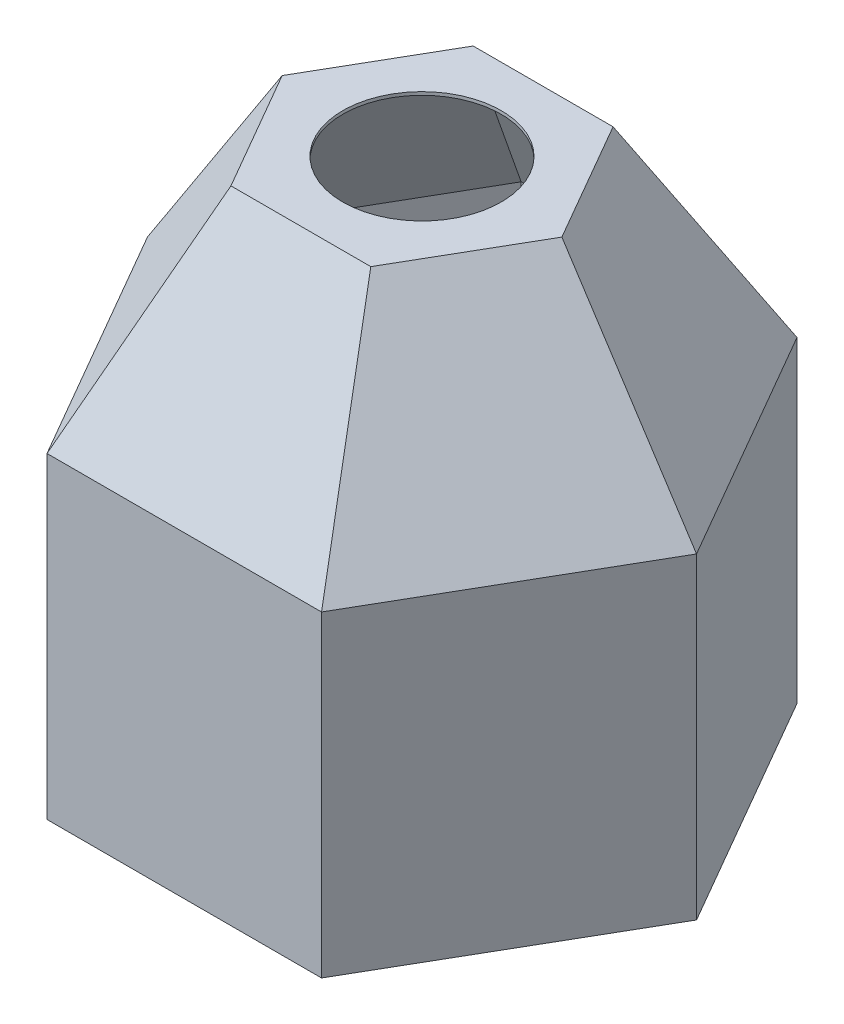
ISO-10303-21;
HEADER;
FILE_DESCRIPTION(('STEP AP214'),'2;1');
FILE_NAME('part.step','',(''),(''),'','','');
FILE_SCHEMA(('AUTOMOTIVE_DESIGN { 1 0 10303 214 1 1 1 1 }'));
ENDSEC;
DATA;
#1=APPLICATION_CONTEXT('core data for automotive mechanical design processes');
#2=APPLICATION_PROTOCOL_DEFINITION('international standard','automotive_design',2000,#1);
#3=PRODUCT_CONTEXT('',#1,'mechanical');
#4=PRODUCT('Part','Part','',(#3));
#5=PRODUCT_RELATED_PRODUCT_CATEGORY('part','',(#4));
#6=PRODUCT_DEFINITION_FORMATION('','',#4);
#7=PRODUCT_DEFINITION_CONTEXT('part definition',#1,'design');
#8=PRODUCT_DEFINITION('design','',#6,#7);
#9=PRODUCT_DEFINITION_SHAPE('','',#8);
#10=(LENGTH_UNIT() NAMED_UNIT(*) SI_UNIT(.MILLI.,.METRE.));
#11=(NAMED_UNIT(*) PLANE_ANGLE_UNIT() SI_UNIT($,.RADIAN.));
#12=(NAMED_UNIT(*) SI_UNIT($,.STERADIAN.) SOLID_ANGLE_UNIT());
#13=UNCERTAINTY_MEASURE_WITH_UNIT(LENGTH_MEASURE(1.E-05),#10,'distance_accuracy_value','');
#14=(GEOMETRIC_REPRESENTATION_CONTEXT(3) GLOBAL_UNCERTAINTY_ASSIGNED_CONTEXT((#13)) GLOBAL_UNIT_ASSIGNED_CONTEXT((#10,
#11,#12)) REPRESENTATION_CONTEXT('',''));
#15=CARTESIAN_POINT('',(0.,0.,0.));
#16=DIRECTION('',(0.,0.,1.));
#17=DIRECTION('',(1.,0.,0.));
#18=AXIS2_PLACEMENT_3D('',#15,#16,#17);
#19=CARTESIAN_POINT('',(130.222507916258,304.8,-225.552));
#20=DIRECTION('',(0.866025403784439,0.,-0.5));
#21=DIRECTION('',(-0.5,0.,-0.866025403784439));
#22=AXIS2_PLACEMENT_3D('',#19,#20,#21);
#23=PLANE('',#22);
#24=DIRECTION('',(0.499999999999995,0.,0.866025403784442));
#25=VECTOR('',#24,1.);
#26=CARTESIAN_POINT('',(130.222507916261,3.048,-225.551999999998));
#27=LINE('',#26,#25);
#28=CARTESIAN_POINT('',(130.222507916258,3.04800000000002,-225.552));
#29=VERTEX_POINT('',#28);
#30=CARTESIAN_POINT('',(260.445015832517,3.048,0.));
#31=VERTEX_POINT('',#30);
#32=EDGE_CURVE('E213',#29,#31,#27,.T.);
#33=ORIENTED_EDGE('',*,*,#32,.T.);
#34=DIRECTION('',(0.,-1.,0.));
#35=VECTOR('',#34,1.);
#36=CARTESIAN_POINT('',(260.445015832517,304.8,0.));
#37=LINE('',#36,#35);
#38=CARTESIAN_POINT('',(260.445015832517,304.8,0.));
#39=VERTEX_POINT('',#38);
#40=EDGE_CURVE('E197',#39,#31,#37,.T.);
#41=ORIENTED_EDGE('',*,*,#40,.F.);
#42=CARTESIAN_POINT('',(130.222507916258,304.8,-225.552));
#43=DIRECTION('',(0.5,0.,0.866025403784439));
#44=VECTOR('',#43,1.);
#45=LINE('',#42,#44);
#46=CARTESIAN_POINT('',(130.222507916258,304.8,-225.552));
#47=VERTEX_POINT('',#46);
#48=EDGE_CURVE('E270',#47,#39,#45,.T.);
#49=ORIENTED_EDGE('',*,*,#48,.F.);
#50=DIRECTION('',(0.,-1.,0.));
#51=VECTOR('',#50,1.);
#52=CARTESIAN_POINT('',(130.222507916258,304.8,-225.552));
#53=LINE('',#52,#51);
#54=EDGE_CURVE('E214',#47,#29,#53,.T.);
#55=ORIENTED_EDGE('',*,*,#54,.T.);
#56=EDGE_LOOP('',(#33,#41,#49,#55));
#57=FACE_BOUND('',#56,.T.);
#58=ADVANCED_FACE('F66',(#57),#23,.F.);
#59=CARTESIAN_POINT('',(-130.222507916258,304.8,-225.552));
#60=DIRECTION('',(0.,0.,-1.));
#61=DIRECTION('',(-1.,0.,0.));
#62=AXIS2_PLACEMENT_3D('',#59,#60,#61);
#63=PLANE('',#62);
#64=DIRECTION('',(1.,0.,0.));
#65=VECTOR('',#64,1.);
#66=CARTESIAN_POINT('',(-130.222507916256,3.048,-225.552000000001));
#67=LINE('',#66,#65);
#68=CARTESIAN_POINT('',(-130.222507916258,3.04800000000005,-225.552));
#69=VERTEX_POINT('',#68);
#70=EDGE_CURVE('E84',#69,#29,#67,.T.);
#71=ORIENTED_EDGE('',*,*,#70,.T.);
#72=ORIENTED_EDGE('',*,*,#54,.F.);
#73=CARTESIAN_POINT('',(-130.222507916258,304.8,-225.552));
#74=DIRECTION('',(1.,0.,0.));
#75=VECTOR('',#74,1.);
#76=LINE('',#73,#75);
#77=CARTESIAN_POINT('',(-130.222507916258,304.8,-225.552));
#78=VERTEX_POINT('',#77);
#79=EDGE_CURVE('E210',#78,#47,#76,.T.);
#80=ORIENTED_EDGE('',*,*,#79,.F.);
#81=DIRECTION('',(0.,-1.,0.));
#82=VECTOR('',#81,1.);
#83=CARTESIAN_POINT('',(-130.222507916258,304.8,-225.552));
#84=LINE('',#83,#82);
#85=EDGE_CURVE('E311',#78,#69,#84,.T.);
#86=ORIENTED_EDGE('',*,*,#85,.T.);
#87=EDGE_LOOP('',(#71,#72,#80,#86));
#88=FACE_BOUND('',#87,.T.);
#89=ADVANCED_FACE('F288',(#88),#63,.F.);
#90=CARTESIAN_POINT('',(-260.445015832517,304.8,0.));
#91=DIRECTION('',(-0.866025403784439,0.,-0.5));
#92=DIRECTION('',(-0.5,0.,0.866025403784439));
#93=AXIS2_PLACEMENT_3D('',#90,#91,#92);
#94=PLANE('',#93);
#95=DIRECTION('',(0.500000000000007,0.,-0.866025403784434));
#96=VECTOR('',#95,1.);
#97=CARTESIAN_POINT('',(-260.445015832517,3.048,-1.8464334007635E-12));
#98=LINE('',#97,#96);
#99=CARTESIAN_POINT('',(-260.445015832517,3.04800000000002,0.));
#100=VERTEX_POINT('',#99);
#101=EDGE_CURVE('E92',#100,#69,#98,.T.);
#102=ORIENTED_EDGE('',*,*,#101,.T.);
#103=ORIENTED_EDGE('',*,*,#85,.F.);
#104=CARTESIAN_POINT('',(-260.445015832517,304.8,-1.11022302462516E-13));
#105=DIRECTION('',(0.5,0.,-0.866025403784439));
#106=VECTOR('',#105,1.);
#107=LINE('',#104,#106);
#108=CARTESIAN_POINT('',(-260.445015832517,304.8,0.));
#109=VERTEX_POINT('',#108);
#110=EDGE_CURVE('E727',#109,#78,#107,.T.);
#111=ORIENTED_EDGE('',*,*,#110,.F.);
#112=DIRECTION('',(0.,-1.,0.));
#113=VECTOR('',#112,1.);
#114=CARTESIAN_POINT('',(-260.445015832517,304.8,0.));
#115=LINE('',#114,#113);
#116=EDGE_CURVE('E305',#109,#100,#115,.T.);
#117=ORIENTED_EDGE('',*,*,#116,.T.);
#118=EDGE_LOOP('',(#102,#103,#111,#117));
#119=FACE_BOUND('',#118,.T.);
#120=ADVANCED_FACE('F277',(#119),#94,.F.);
#121=CARTESIAN_POINT('',(-130.222507916258,304.8,225.552));
#122=DIRECTION('',(-0.866025403784439,0.,0.5));
#123=DIRECTION('',(0.5,0.,0.866025403784439));
#124=AXIS2_PLACEMENT_3D('',#121,#122,#123);
#125=PLANE('',#124);
#126=DIRECTION('',(-0.499999999999995,0.,-0.866025403784442));
#127=VECTOR('',#126,1.);
#128=CARTESIAN_POINT('',(-130.22250791626,3.048,225.551999999999));
#129=LINE('',#128,#127);
#130=CARTESIAN_POINT('',(-130.222507916258,3.04800000000002,225.552));
#131=VERTEX_POINT('',#130);
#132=EDGE_CURVE('E222',#131,#100,#129,.T.);
#133=ORIENTED_EDGE('',*,*,#132,.T.);
#134=ORIENTED_EDGE('',*,*,#116,.F.);
#135=CARTESIAN_POINT('',(-130.222507916258,304.8,225.552));
#136=DIRECTION('',(-0.5,0.,-0.866025403784439));
#137=VECTOR('',#136,1.);
#138=LINE('',#135,#137);
#139=CARTESIAN_POINT('',(-130.222507916258,304.8,225.552));
#140=VERTEX_POINT('',#139);
#141=EDGE_CURVE('E718',#140,#109,#138,.T.);
#142=ORIENTED_EDGE('',*,*,#141,.F.);
#143=DIRECTION('',(0.,-1.,0.));
#144=VECTOR('',#143,1.);
#145=CARTESIAN_POINT('',(-130.222507916258,304.8,225.552));
#146=LINE('',#145,#144);
#147=EDGE_CURVE('E312',#140,#131,#146,.T.);
#148=ORIENTED_EDGE('',*,*,#147,.T.);
#149=EDGE_LOOP('',(#133,#134,#142,#148));
#150=FACE_BOUND('',#149,.T.);
#151=ADVANCED_FACE('F287',(#150),#125,.F.);
#152=CARTESIAN_POINT('',(130.222507916259,304.8,225.552));
#153=DIRECTION('',(0.,0.,1.));
#154=DIRECTION('',(1.,0.,0.));
#155=AXIS2_PLACEMENT_3D('',#152,#153,#154);
#156=PLANE('',#155);
#157=DIRECTION('',(-1.,0.,0.));
#158=VECTOR('',#157,1.);
#159=CARTESIAN_POINT('',(130.222507916258,3.048,225.552));
#160=LINE('',#159,#158);
#161=CARTESIAN_POINT('',(130.222507916259,3.04800000000005,225.552));
#162=VERTEX_POINT('',#161);
#163=EDGE_CURVE('E220',#162,#131,#160,.T.);
#164=ORIENTED_EDGE('',*,*,#163,.T.);
#165=ORIENTED_EDGE('',*,*,#147,.F.);
#166=CARTESIAN_POINT('',(130.222507916259,304.8,225.552));
#167=DIRECTION('',(-1.,0.,0.));
#168=VECTOR('',#167,1.);
#169=LINE('',#166,#168);
#170=CARTESIAN_POINT('',(130.222507916259,304.8,225.552));
#171=VERTEX_POINT('',#170);
#172=EDGE_CURVE('E334',#171,#140,#169,.T.);
#173=ORIENTED_EDGE('',*,*,#172,.F.);
#174=DIRECTION('',(0.,-1.,0.));
#175=VECTOR('',#174,1.);
#176=CARTESIAN_POINT('',(130.222507916259,304.8,225.552));
#177=LINE('',#176,#175);
#178=EDGE_CURVE('E209',#171,#162,#177,.T.);
#179=ORIENTED_EDGE('',*,*,#178,.T.);
#180=EDGE_LOOP('',(#164,#165,#173,#179));
#181=FACE_BOUND('',#180,.T.);
#182=ADVANCED_FACE('F294',(#181),#156,.F.);
#183=CARTESIAN_POINT('',(260.445015832517,304.8,0.));
#184=DIRECTION('',(0.866025403784439,0.,0.5));
#185=DIRECTION('',(0.5,0.,-0.866025403784439));
#186=AXIS2_PLACEMENT_3D('',#183,#184,#185);
#187=PLANE('',#186);
#188=DIRECTION('',(-0.500000000000001,0.,0.866025403784438));
#189=VECTOR('',#188,1.);
#190=CARTESIAN_POINT('',(260.445015832517,3.048,0.));
#191=LINE('',#190,#189);
#192=EDGE_CURVE('E202',#31,#162,#191,.T.);
#193=ORIENTED_EDGE('',*,*,#192,.T.);
#194=ORIENTED_EDGE('',*,*,#178,.F.);
#195=CARTESIAN_POINT('',(260.445015832517,304.8,0.));
#196=DIRECTION('',(-0.5,0.,0.866025403784439));
#197=VECTOR('',#196,1.);
#198=LINE('',#195,#197);
#199=EDGE_CURVE('E205',#39,#171,#198,.T.);
#200=ORIENTED_EDGE('',*,*,#199,.F.);
#201=ORIENTED_EDGE('',*,*,#40,.T.);
#202=EDGE_LOOP('',(#193,#194,#200,#201));
#203=FACE_BOUND('',#202,.T.);
#204=ADVANCED_FACE('F199',(#203),#187,.F.);
#205=CARTESIAN_POINT('',(0.,169.799612844769,301.565405552463));
#206=DIRECTION('',(0.,-0.490632304430779,-0.871366709169534));
#207=DIRECTION('',(0.,0.871366709169534,-0.490632304430779));
#208=AXIS2_PLACEMENT_3D('',#205,#206,#207);
#209=PLANE('',#208);
#210=DIRECTION('',(-0.272543219118308,-0.838379851171602,0.472058702771288));
#211=VECTOR('',#210,1.);
#212=CARTESIAN_POINT('',(-65.4867364082733,503.936,113.426354681));
#213=LINE('',#212,#211);
#214=CARTESIAN_POINT('',(-66.4775900538037,500.888,115.142563537923));
#215=VERTEX_POINT('',#214);
#216=EDGE_CURVE('E249',#215,#140,#213,.T.);
#217=ORIENTED_EDGE('',*,*,#216,.F.);
#218=DIRECTION('',(1.,0.,0.));
#219=VECTOR('',#218,1.);
#220=CARTESIAN_POINT('',(0.,500.888,115.142563537924));
#221=LINE('',#220,#219);
#222=CARTESIAN_POINT('',(66.4775900538037,500.888,115.142563537924));
#223=VERTEX_POINT('',#222);
#224=EDGE_CURVE('E246',#215,#223,#221,.T.);
#225=ORIENTED_EDGE('',*,*,#224,.T.);
#226=DIRECTION('',(0.272543219118309,-0.838379851171602,0.472058702771287));
#227=VECTOR('',#226,1.);
#228=CARTESIAN_POINT('',(65.4867364082733,503.936,113.426354681));
#229=LINE('',#228,#227);
#230=EDGE_CURVE('E70',#223,#171,#229,.T.);
#231=ORIENTED_EDGE('',*,*,#230,.T.);
#232=ORIENTED_EDGE('',*,*,#172,.T.);
#233=EDGE_LOOP('',(#217,#225,#231,#232));
#234=FACE_BOUND('',#233,.T.);
#235=ADVANCED_FACE('F348',(#234),#209,.T.);
#236=CARTESIAN_POINT('',(261.16330211099,169.799612844769,150.782702776231));
#237=DIRECTION('',(-0.754625706152864,-0.490632304430779,-0.435683354584767));
#238=DIRECTION('',(0.545086438236617,-0.838379851171603,0.));
#239=AXIS2_PLACEMENT_3D('',#236,#237,#238);
#240=PLANE('',#239);
#241=ORIENTED_EDGE('',*,*,#230,.F.);
#242=DIRECTION('',(0.5,0.,-0.866025403784439));
#243=VECTOR('',#242,1.);
#244=CARTESIAN_POINT('',(99.7163850807056,500.888,57.5712817689618));
#245=LINE('',#244,#243);
#246=CARTESIAN_POINT('',(132.955180107607,500.888,0.));
#247=VERTEX_POINT('',#246);
#248=EDGE_CURVE('E243',#223,#247,#245,.T.);
#249=ORIENTED_EDGE('',*,*,#248,.T.);
#250=DIRECTION('',(0.545086438236617,-0.838379851171602,0.));
#251=VECTOR('',#250,1.);
#252=CARTESIAN_POINT('',(130.973472816547,503.936,0.));
#253=LINE('',#252,#251);
#254=EDGE_CURVE('E268',#247,#39,#253,.T.);
#255=ORIENTED_EDGE('',*,*,#254,.T.);
#256=ORIENTED_EDGE('',*,*,#199,.T.);
#257=EDGE_LOOP('',(#241,#249,#255,#256));
#258=FACE_BOUND('',#257,.T.);
#259=ADVANCED_FACE('F693',(#258),#240,.T.);
#260=CARTESIAN_POINT('',(-261.163302110989,169.799612844768,150.782702776231));
#261=DIRECTION('',(0.754625706152864,-0.490632304430778,-0.435683354584767));
#262=DIRECTION('',(0.545086438236617,0.838379851171603,0.));
#263=AXIS2_PLACEMENT_3D('',#260,#261,#262);
#264=PLANE('',#263);
#265=DIRECTION('',(-0.545086438236617,-0.838379851171603,0.));
#266=VECTOR('',#265,1.);
#267=CARTESIAN_POINT('',(-130.973472816547,503.936,0.));
#268=LINE('',#267,#266);
#269=CARTESIAN_POINT('',(-132.955180107607,500.888,0.));
#270=VERTEX_POINT('',#269);
#271=EDGE_CURVE('E254',#270,#109,#268,.T.);
#272=ORIENTED_EDGE('',*,*,#271,.F.);
#273=DIRECTION('',(0.5,0.,0.866025403784439));
#274=VECTOR('',#273,1.);
#275=CARTESIAN_POINT('',(-99.7163850807055,500.888,57.5712817689617));
#276=LINE('',#275,#274);
#277=EDGE_CURVE('E240',#270,#215,#276,.T.);
#278=ORIENTED_EDGE('',*,*,#277,.T.);
#279=ORIENTED_EDGE('',*,*,#216,.T.);
#280=ORIENTED_EDGE('',*,*,#141,.T.);
#281=EDGE_LOOP('',(#272,#278,#279,#280));
#282=FACE_BOUND('',#281,.T.);
#283=ADVANCED_FACE('F657',(#282),#264,.T.);
#284=CARTESIAN_POINT('',(-261.163302110989,169.799612844769,-150.782702776231));
#285=DIRECTION('',(0.754625706152864,-0.490632304430778,0.435683354584767));
#286=DIRECTION('',(0.545086438236617,0.838379851171603,0.));
#287=AXIS2_PLACEMENT_3D('',#284,#285,#286);
#288=PLANE('',#287);
#289=DIRECTION('',(-0.272543219118308,-0.838379851171603,-0.472058702771288));
#290=VECTOR('',#289,1.);
#291=CARTESIAN_POINT('',(-65.4867364082733,503.936,-113.426354681));
#292=LINE('',#291,#290);
#293=CARTESIAN_POINT('',(-66.4775900538037,500.888,-115.142563537924));
#294=VERTEX_POINT('',#293);
#295=EDGE_CURVE('E256',#294,#78,#292,.T.);
#296=ORIENTED_EDGE('',*,*,#295,.F.);
#297=DIRECTION('',(-0.5,0.,0.866025403784439));
#298=VECTOR('',#297,1.);
#299=CARTESIAN_POINT('',(-99.7163850807056,500.888,-57.5712817689618));
#300=LINE('',#299,#298);
#301=EDGE_CURVE('E237',#294,#270,#300,.T.);
#302=ORIENTED_EDGE('',*,*,#301,.T.);
#303=ORIENTED_EDGE('',*,*,#271,.T.);
#304=ORIENTED_EDGE('',*,*,#110,.T.);
#305=EDGE_LOOP('',(#296,#302,#303,#304));
#306=FACE_BOUND('',#305,.T.);
#307=ADVANCED_FACE('F646',(#306),#288,.T.);
#308=CARTESIAN_POINT('',(0.,169.799612844769,-301.565405552463));
#309=DIRECTION('',(0.,-0.490632304430779,0.871366709169534));
#310=DIRECTION('',(0.,-0.871366709169534,-0.490632304430779));
#311=AXIS2_PLACEMENT_3D('',#308,#309,#310);
#312=PLANE('',#311);
#313=DIRECTION('',(0.272543219118308,-0.838379851171602,-0.472058702771288));
#314=VECTOR('',#313,1.);
#315=CARTESIAN_POINT('',(65.4867364082733,503.936,-113.426354681));
#316=LINE('',#315,#314);
#317=CARTESIAN_POINT('',(66.4775900538037,500.888,-115.142563537924));
#318=VERTEX_POINT('',#317);
#319=EDGE_CURVE('E266',#318,#47,#316,.T.);
#320=ORIENTED_EDGE('',*,*,#319,.F.);
#321=DIRECTION('',(-1.,0.,0.));
#322=VECTOR('',#321,1.);
#323=CARTESIAN_POINT('',(0.,500.888,-115.142563537924));
#324=LINE('',#323,#322);
#325=EDGE_CURVE('E232',#318,#294,#324,.T.);
#326=ORIENTED_EDGE('',*,*,#325,.T.);
#327=ORIENTED_EDGE('',*,*,#295,.T.);
#328=ORIENTED_EDGE('',*,*,#79,.T.);
#329=EDGE_LOOP('',(#320,#326,#327,#328));
#330=FACE_BOUND('',#329,.T.);
#331=ADVANCED_FACE('F656',(#330),#312,.T.);
#332=CARTESIAN_POINT('',(261.163302110989,169.799612844769,-150.782702776231));
#333=DIRECTION('',(-0.754625706152864,-0.490632304430779,0.435683354584767));
#334=DIRECTION('',(0.545086438236617,-0.838379851171603,0.));
#335=AXIS2_PLACEMENT_3D('',#332,#333,#334);
#336=PLANE('',#335);
#337=ORIENTED_EDGE('',*,*,#254,.F.);
#338=DIRECTION('',(-0.5,0.,-0.866025403784439));
#339=VECTOR('',#338,1.);
#340=CARTESIAN_POINT('',(99.7163850807056,500.888,-57.5712817689617));
#341=LINE('',#340,#339);
#342=EDGE_CURVE('E12',#247,#318,#341,.T.);
#343=ORIENTED_EDGE('',*,*,#342,.T.);
#344=ORIENTED_EDGE('',*,*,#319,.T.);
#345=ORIENTED_EDGE('',*,*,#48,.T.);
#346=EDGE_LOOP('',(#337,#343,#344,#345));
#347=FACE_BOUND('',#346,.T.);
#348=ADVANCED_FACE('F663',(#347),#336,.T.);
#349=CARTESIAN_POINT('',(0.,503.936,0.));
#350=DIRECTION('',(0.,1.,0.));
#351=DIRECTION('',(0.,0.,1.));
#352=AXIS2_PLACEMENT_3D('',#349,#350,#351);
#353=PLANE('',#352);
#354=CARTESIAN_POINT('',(0.,503.936,0.));
#355=DIRECTION('',(0.,1.,0.));
#356=DIRECTION('',(0.,0.,1.));
#357=AXIS2_PLACEMENT_3D('',#354,#355,#356);
#358=CIRCLE('',#357,76.2);
#359=CARTESIAN_POINT('',(0.,503.936,76.2));
#360=VERTEX_POINT('',#359);
#361=EDGE_CURVE('E228',#360,#360,#358,.T.);
#362=ORIENTED_EDGE('',*,*,#361,.F.);
#363=EDGE_LOOP('',(#362));
#364=FACE_BOUND('',#363,.T.);
#365=DIRECTION('',(0.5,0.,-0.866025403784439));
#366=VECTOR('',#365,1.);
#367=CARTESIAN_POINT('',(67.2465,503.936,116.474354631181));
#368=LINE('',#367,#366);
#369=CARTESIAN_POINT('',(67.2465,503.936,116.474354631181));
#370=VERTEX_POINT('',#369);
#371=CARTESIAN_POINT('',(134.493,503.936,0.));
#372=VERTEX_POINT('',#371);
#373=EDGE_CURVE('E370',#370,#372,#368,.T.);
#374=ORIENTED_EDGE('',*,*,#373,.T.);
#375=DIRECTION('',(-0.5,0.,-0.866025403784439));
#376=VECTOR('',#375,1.);
#377=CARTESIAN_POINT('',(134.493,503.936,0.));
#378=LINE('',#377,#376);
#379=CARTESIAN_POINT('',(67.2464999999999,503.936,-116.474354631181));
#380=VERTEX_POINT('',#379);
#381=EDGE_CURVE('E446',#372,#380,#378,.T.);
#382=ORIENTED_EDGE('',*,*,#381,.T.);
#383=DIRECTION('',(-1.,0.,0.));
#384=VECTOR('',#383,1.);
#385=CARTESIAN_POINT('',(67.2464999999999,503.936,-116.474354631181));
#386=LINE('',#385,#384);
#387=CARTESIAN_POINT('',(-67.2465,503.936,-116.474354631181));
#388=VERTEX_POINT('',#387);
#389=EDGE_CURVE('E449',#380,#388,#386,.T.);
#390=ORIENTED_EDGE('',*,*,#389,.T.);
#391=DIRECTION('',(-0.5,0.,0.866025403784439));
#392=VECTOR('',#391,1.);
#393=CARTESIAN_POINT('',(-67.2465,503.936,-116.474354631181));
#394=LINE('',#393,#392);
#395=CARTESIAN_POINT('',(-134.493,503.936,0.));
#396=VERTEX_POINT('',#395);
#397=EDGE_CURVE('E530',#388,#396,#394,.T.);
#398=ORIENTED_EDGE('',*,*,#397,.T.);
#399=DIRECTION('',(0.5,0.,0.866025403784439));
#400=VECTOR('',#399,1.);
#401=CARTESIAN_POINT('',(-134.493,503.936,0.));
#402=LINE('',#401,#400);
#403=CARTESIAN_POINT('',(-67.2465,503.936,116.474354631181));
#404=VERTEX_POINT('',#403);
#405=EDGE_CURVE('E597',#396,#404,#402,.T.);
#406=ORIENTED_EDGE('',*,*,#405,.T.);
#407=DIRECTION('',(1.,0.,0.));
#408=VECTOR('',#407,1.);
#409=CARTESIAN_POINT('',(-67.2465,503.936,116.474354631181));
#410=LINE('',#409,#408);
#411=EDGE_CURVE('E601',#404,#370,#410,.T.);
#412=ORIENTED_EDGE('',*,*,#411,.T.);
#413=EDGE_LOOP('',(#374,#382,#390,#398,#406,#412));
#414=FACE_BOUND('',#413,.T.);
#415=ADVANCED_FACE('F352',(#364,#414),#353,.T.);
#416=CARTESIAN_POINT('',(131.982271536751,304.8,228.599999999999));
#417=DIRECTION('',(-0.866025403784442,0.,-0.499999999999995));
#418=DIRECTION('',(-0.499999999999995,0.,0.866025403784442));
#419=AXIS2_PLACEMENT_3D('',#416,#417,#418);
#420=PLANE('',#419);
#421=DIRECTION('',(0.499999999999995,0.,-0.866025403784441));
#422=VECTOR('',#421,1.);
#423=CARTESIAN_POINT('',(131.982271536751,0.,228.599999999999));
#424=LINE('',#423,#422);
#425=CARTESIAN_POINT('',(131.982271536751,0.,228.599999999999));
#426=VERTEX_POINT('',#425);
#427=CARTESIAN_POINT('',(263.964543073497,0.,0.));
#428=VERTEX_POINT('',#427);
#429=EDGE_CURVE('E429',#426,#428,#424,.T.);
#430=ORIENTED_EDGE('',*,*,#429,.T.);
#431=DIRECTION('',(0.,-1.,0.));
#432=VECTOR('',#431,1.);
#433=CARTESIAN_POINT('',(263.964543073497,304.8,0.));
#434=LINE('',#433,#432);
#435=CARTESIAN_POINT('',(263.964543073497,304.8,0.));
#436=VERTEX_POINT('',#435);
#437=EDGE_CURVE('E76',#436,#428,#434,.T.);
#438=ORIENTED_EDGE('',*,*,#437,.F.);
#439=DIRECTION('',(0.499999999999995,0.,-0.866025403784442));
#440=VECTOR('',#439,1.);
#441=CARTESIAN_POINT('',(131.982271536751,304.8,228.599999999999));
#442=LINE('',#441,#440);
#443=CARTESIAN_POINT('',(131.982271536751,304.799999999999,228.599999999999));
#444=VERTEX_POINT('',#443);
#445=EDGE_CURVE('E384',#444,#436,#442,.T.);
#446=ORIENTED_EDGE('',*,*,#445,.F.);
#447=DIRECTION('',(0.,-1.,0.));
#448=VECTOR('',#447,1.);
#449=CARTESIAN_POINT('',(131.982271536751,304.8,228.599999999999));
#450=LINE('',#449,#448);
#451=EDGE_CURVE('E392',#444,#426,#450,.T.);
#452=ORIENTED_EDGE('',*,*,#451,.T.);
#453=EDGE_LOOP('',(#430,#438,#446,#452));
#454=FACE_BOUND('',#453,.T.);
#455=ADVANCED_FACE('F68',(#454),#420,.F.);
#456=CARTESIAN_POINT('',(263.964543073497,304.8,0.));
#457=DIRECTION('',(-0.866025403784438,0.,0.500000000000001));
#458=DIRECTION('',(0.500000000000001,0.,0.866025403784438));
#459=AXIS2_PLACEMENT_3D('',#456,#457,#458);
#460=PLANE('',#459);
#461=DIRECTION('',(-0.500000000000001,0.,-0.866025403784438));
#462=VECTOR('',#461,1.);
#463=CARTESIAN_POINT('',(263.964543073497,0.,0.));
#464=LINE('',#463,#462);
#465=CARTESIAN_POINT('',(131.982271536748,0.,-228.6));
#466=VERTEX_POINT('',#465);
#467=EDGE_CURVE('E427',#428,#466,#464,.T.);
#468=ORIENTED_EDGE('',*,*,#467,.T.);
#469=DIRECTION('',(0.,-1.,0.));
#470=VECTOR('',#469,1.);
#471=CARTESIAN_POINT('',(131.982271536748,304.8,-228.6));
#472=LINE('',#471,#470);
#473=CARTESIAN_POINT('',(131.982271536748,304.8,-228.6));
#474=VERTEX_POINT('',#473);
#475=EDGE_CURVE('E404',#474,#466,#472,.T.);
#476=ORIENTED_EDGE('',*,*,#475,.F.);
#477=DIRECTION('',(-0.500000000000001,0.,-0.866025403784438));
#478=VECTOR('',#477,1.);
#479=CARTESIAN_POINT('',(263.964543073497,304.8,0.));
#480=LINE('',#479,#478);
#481=EDGE_CURVE('E387',#436,#474,#480,.T.);
#482=ORIENTED_EDGE('',*,*,#481,.F.);
#483=ORIENTED_EDGE('',*,*,#437,.T.);
#484=EDGE_LOOP('',(#468,#476,#482,#483));
#485=FACE_BOUND('',#484,.T.);
#486=ADVANCED_FACE('F577',(#485),#460,.F.);
#487=CARTESIAN_POINT('',(131.982271536748,304.8,-228.6));
#488=DIRECTION('',(0.,0.,1.));
#489=DIRECTION('',(1.,0.,0.));
#490=AXIS2_PLACEMENT_3D('',#487,#488,#489);
#491=PLANE('',#490);
#492=DIRECTION('',(-1.,0.,0.));
#493=VECTOR('',#492,1.);
#494=CARTESIAN_POINT('',(131.982271536748,0.,-228.6));
#495=LINE('',#494,#493);
#496=CARTESIAN_POINT('',(-131.98227153675,0.,-228.6));
#497=VERTEX_POINT('',#496);
#498=EDGE_CURVE('E425',#466,#497,#495,.T.);
#499=ORIENTED_EDGE('',*,*,#498,.T.);
#500=DIRECTION('',(0.,-1.,0.));
#501=VECTOR('',#500,1.);
#502=CARTESIAN_POINT('',(-131.98227153675,304.8,-228.6));
#503=LINE('',#502,#501);
#504=CARTESIAN_POINT('',(-131.98227153675,304.8,-228.6));
#505=VERTEX_POINT('',#504);
#506=EDGE_CURVE('E407',#505,#497,#503,.T.);
#507=ORIENTED_EDGE('',*,*,#506,.F.);
#508=DIRECTION('',(1.,0.,0.));
#509=VECTOR('',#508,1.);
#510=CARTESIAN_POINT('',(-9.90530867442421E-13,304.8,-228.6));
#511=LINE('',#510,#509);
#512=EDGE_CURVE('E399',#474,#505,#511,.F.);
#513=ORIENTED_EDGE('',*,*,#512,.F.);
#514=ORIENTED_EDGE('',*,*,#475,.T.);
#515=EDGE_LOOP('',(#499,#507,#513,#514));
#516=FACE_BOUND('',#515,.T.);
#517=ADVANCED_FACE('F574',(#516),#491,.F.);
#518=CARTESIAN_POINT('',(-131.98227153675,304.8,-228.6));
#519=DIRECTION('',(0.866025403784442,0.,0.499999999999995));
#520=DIRECTION('',(0.499999999999995,0.,-0.866025403784442));
#521=AXIS2_PLACEMENT_3D('',#518,#519,#520);
#522=PLANE('',#521);
#523=DIRECTION('',(-0.499999999999995,0.,0.866025403784441));
#524=VECTOR('',#523,1.);
#525=CARTESIAN_POINT('',(-131.98227153675,0.,-228.6));
#526=LINE('',#525,#524);
#527=CARTESIAN_POINT('',(-263.964543073497,0.,1.84325455251474E-12));
#528=VERTEX_POINT('',#527);
#529=EDGE_CURVE('E423',#497,#528,#526,.T.);
#530=ORIENTED_EDGE('',*,*,#529,.T.);
#531=DIRECTION('',(0.,-1.,0.));
#532=VECTOR('',#531,1.);
#533=CARTESIAN_POINT('',(-263.964543073497,304.8,1.84325455251474E-12));
#534=LINE('',#533,#532);
#535=CARTESIAN_POINT('',(-263.964543073497,304.8,1.85660476343673E-12));
#536=VERTEX_POINT('',#535);
#537=EDGE_CURVE('E410',#536,#528,#534,.T.);
#538=ORIENTED_EDGE('',*,*,#537,.F.);
#539=DIRECTION('',(-0.499999999999995,0.,0.866025403784442));
#540=VECTOR('',#539,1.);
#541=CARTESIAN_POINT('',(-131.98227153675,304.8,-228.6));
#542=LINE('',#541,#540);
#543=EDGE_CURVE('E396',#505,#536,#542,.T.);
#544=ORIENTED_EDGE('',*,*,#543,.F.);
#545=ORIENTED_EDGE('',*,*,#506,.T.);
#546=EDGE_LOOP('',(#530,#538,#544,#545));
#547=FACE_BOUND('',#546,.T.);
#548=ADVANCED_FACE('F570',(#547),#522,.F.);
#549=CARTESIAN_POINT('',(-263.964543073497,304.8,1.84325455251474E-12));
#550=DIRECTION('',(0.866025403784435,0.,-0.500000000000007));
#551=DIRECTION('',(-0.500000000000007,0.,-0.866025403784435));
#552=AXIS2_PLACEMENT_3D('',#549,#550,#551);
#553=PLANE('',#552);
#554=DIRECTION('',(0.500000000000007,0.,0.866025403784435));
#555=VECTOR('',#554,1.);
#556=CARTESIAN_POINT('',(-263.964543073497,0.,1.84325455251474E-12));
#557=LINE('',#556,#555);
#558=CARTESIAN_POINT('',(-131.982271536746,0.,228.600000000001));
#559=VERTEX_POINT('',#558);
#560=EDGE_CURVE('E421',#528,#559,#557,.T.);
#561=ORIENTED_EDGE('',*,*,#560,.T.);
#562=DIRECTION('',(0.,-1.,0.));
#563=VECTOR('',#562,1.);
#564=CARTESIAN_POINT('',(-131.982271536746,304.8,228.600000000001));
#565=LINE('',#564,#563);
#566=CARTESIAN_POINT('',(-131.982271536746,304.8,228.600000000001));
#567=VERTEX_POINT('',#566);
#568=EDGE_CURVE('E413',#567,#559,#565,.T.);
#569=ORIENTED_EDGE('',*,*,#568,.F.);
#570=DIRECTION('',(0.500000000000007,0.,0.866025403784435));
#571=VECTOR('',#570,1.);
#572=CARTESIAN_POINT('',(-263.964543073497,304.8,1.85962356624714E-12));
#573=LINE('',#572,#571);
#574=EDGE_CURVE('E393',#536,#567,#573,.T.);
#575=ORIENTED_EDGE('',*,*,#574,.F.);
#576=ORIENTED_EDGE('',*,*,#537,.T.);
#577=EDGE_LOOP('',(#561,#569,#575,#576));
#578=FACE_BOUND('',#577,.T.);
#579=ADVANCED_FACE('F566',(#578),#553,.F.);
#580=CARTESIAN_POINT('',(-131.982271536746,304.8,228.600000000001));
#581=DIRECTION('',(0.,0.,-1.));
#582=DIRECTION('',(-1.,0.,0.));
#583=AXIS2_PLACEMENT_3D('',#580,#581,#582);
#584=PLANE('',#583);
#585=DIRECTION('',(1.,0.,0.));
#586=VECTOR('',#585,1.);
#587=CARTESIAN_POINT('',(-131.982271536746,0.,228.600000000001));
#588=LINE('',#587,#586);
#589=EDGE_CURVE('E388',#559,#426,#588,.T.);
#590=ORIENTED_EDGE('',*,*,#589,.T.);
#591=ORIENTED_EDGE('',*,*,#451,.F.);
#592=DIRECTION('',(1.,0.,0.));
#593=VECTOR('',#592,1.);
#594=CARTESIAN_POINT('',(3.16330825409031E-12,304.799999999999,228.6));
#595=LINE('',#594,#593);
#596=EDGE_CURVE('E389',#567,#444,#595,.T.);
#597=ORIENTED_EDGE('',*,*,#596,.F.);
#598=ORIENTED_EDGE('',*,*,#568,.T.);
#599=EDGE_LOOP('',(#590,#591,#597,#598));
#600=FACE_BOUND('',#599,.T.);
#601=ADVANCED_FACE('F562',(#600),#584,.F.);
#602=CARTESIAN_POINT('',(0.,0.,0.));
#603=DIRECTION('',(0.,1.,0.));
#604=DIRECTION('',(0.,0.,1.));
#605=AXIS2_PLACEMENT_3D('',#602,#603,#604);
#606=PLANE('',#605);
#607=ORIENTED_EDGE('',*,*,#429,.F.);
#608=ORIENTED_EDGE('',*,*,#589,.F.);
#609=ORIENTED_EDGE('',*,*,#560,.F.);
#610=ORIENTED_EDGE('',*,*,#529,.F.);
#611=ORIENTED_EDGE('',*,*,#498,.F.);
#612=ORIENTED_EDGE('',*,*,#467,.F.);
#613=EDGE_LOOP('',(#607,#608,#609,#610,#611,#612));
#614=FACE_BOUND('',#613,.T.);
#615=ADVANCED_FACE('F559',(#614),#606,.F.);
#616=CARTESIAN_POINT('',(3.16330825409031E-12,171.102695877878,303.879690808113));
#617=DIRECTION('',(0.,0.490632304596301,0.871366709076335));
#618=DIRECTION('',(0.,-0.871366709076335,0.490632304596301));
#619=AXIS2_PLACEMENT_3D('',#616,#617,#618);
#620=PLANE('',#619);
#621=DIRECTION('',(-0.272543219203416,-0.838379851060923,0.472058702918719));
#622=VECTOR('',#621,1.);
#623=CARTESIAN_POINT('',(-67.2465,503.936,116.474354631181));
#624=LINE('',#623,#622);
#625=EDGE_CURVE('E598',#404,#567,#624,.T.);
#626=ORIENTED_EDGE('',*,*,#625,.T.);
#627=ORIENTED_EDGE('',*,*,#596,.T.);
#628=DIRECTION('',(0.272543219203436,-0.838379851060923,0.472058702918707));
#629=VECTOR('',#628,1.);
#630=CARTESIAN_POINT('',(67.2465,503.936,116.474354631181));
#631=LINE('',#630,#629);
#632=EDGE_CURVE('E523',#370,#444,#631,.T.);
#633=ORIENTED_EDGE('',*,*,#632,.F.);
#634=ORIENTED_EDGE('',*,*,#411,.F.);
#635=EDGE_LOOP('',(#626,#627,#633,#634));
#636=FACE_BOUND('',#635,.T.);
#637=ADVANCED_FACE('F500',(#636),#620,.T.);
#638=CARTESIAN_POINT('',(263.167531933987,171.10269587788,151.939845404055));
#639=DIRECTION('',(0.754625706072152,0.490632304596303,0.435683354538163));
#640=DIRECTION('',(-0.545086438406852,0.838379851060921,0.));
#641=AXIS2_PLACEMENT_3D('',#638,#639,#640);
#642=PLANE('',#641);
#643=ORIENTED_EDGE('',*,*,#632,.T.);
#644=ORIENTED_EDGE('',*,*,#445,.T.);
#645=DIRECTION('',(0.54508643840685,-0.838379851060923,0.));
#646=VECTOR('',#645,1.);
#647=CARTESIAN_POINT('',(134.493,503.936,0.));
#648=LINE('',#647,#646);
#649=EDGE_CURVE('E432',#372,#436,#648,.T.);
#650=ORIENTED_EDGE('',*,*,#649,.F.);
#651=ORIENTED_EDGE('',*,*,#373,.F.);
#652=EDGE_LOOP('',(#643,#644,#650,#651));
#653=FACE_BOUND('',#652,.T.);
#654=ADVANCED_FACE('F472',(#653),#642,.T.);
#655=CARTESIAN_POINT('',(-263.167531933985,171.102695877878,151.939845404058));
#656=DIRECTION('',(-0.754625706072147,0.490632304596301,0.435683354538174));
#657=DIRECTION('',(-0.545086438406853,-0.838379851060921,0.));
#658=AXIS2_PLACEMENT_3D('',#655,#656,#657);
#659=PLANE('',#658);
#660=DIRECTION('',(-0.54508643840685,-0.838379851060923,0.));
#661=VECTOR('',#660,1.);
#662=CARTESIAN_POINT('',(-134.493,503.936,0.));
#663=LINE('',#662,#661);
#664=EDGE_CURVE('E515',#396,#536,#663,.T.);
#665=ORIENTED_EDGE('',*,*,#664,.T.);
#666=ORIENTED_EDGE('',*,*,#574,.T.);
#667=ORIENTED_EDGE('',*,*,#625,.F.);
#668=ORIENTED_EDGE('',*,*,#405,.F.);
#669=EDGE_LOOP('',(#665,#666,#667,#668));
#670=FACE_BOUND('',#669,.T.);
#671=ADVANCED_FACE('F499',(#670),#659,.T.);
#672=CARTESIAN_POINT('',(-263.167531933987,171.102695877878,-151.939845404055));
#673=DIRECTION('',(-0.754625706072154,0.4906323045963,-0.435683354538163));
#674=DIRECTION('',(-0.545086438406849,-0.838379851060923,0.));
#675=AXIS2_PLACEMENT_3D('',#672,#673,#674);
#676=PLANE('',#675);
#677=DIRECTION('',(-0.272543219203429,-0.838379851060923,-0.472058702918711));
#678=VECTOR('',#677,1.);
#679=CARTESIAN_POINT('',(-67.2465,503.936,-116.474354631181));
#680=LINE('',#679,#678);
#681=EDGE_CURVE('E477',#388,#505,#680,.T.);
#682=ORIENTED_EDGE('',*,*,#681,.T.);
#683=ORIENTED_EDGE('',*,*,#543,.T.);
#684=ORIENTED_EDGE('',*,*,#664,.F.);
#685=ORIENTED_EDGE('',*,*,#397,.F.);
#686=EDGE_LOOP('',(#682,#683,#684,#685));
#687=FACE_BOUND('',#686,.T.);
#688=ADVANCED_FACE('F505',(#687),#676,.T.);
#689=CARTESIAN_POINT('',(-9.90530867442421E-13,171.102695877878,-303.879690808113));
#690=DIRECTION('',(0.,0.4906323045963,-0.871366709076336));
#691=DIRECTION('',(0.,0.871366709076336,0.4906323045963));
#692=AXIS2_PLACEMENT_3D('',#689,#690,#691);
#693=PLANE('',#692);
#694=DIRECTION('',(0.272543219203423,-0.838379851060923,-0.472058702918715));
#695=VECTOR('',#694,1.);
#696=CARTESIAN_POINT('',(67.2464999999999,503.936,-116.474354631181));
#697=LINE('',#696,#695);
#698=EDGE_CURVE('E467',#380,#474,#697,.T.);
#699=ORIENTED_EDGE('',*,*,#698,.T.);
#700=ORIENTED_EDGE('',*,*,#512,.T.);
#701=ORIENTED_EDGE('',*,*,#681,.F.);
#702=ORIENTED_EDGE('',*,*,#389,.F.);
#703=EDGE_LOOP('',(#699,#700,#701,#702));
#704=FACE_BOUND('',#703,.T.);
#705=ADVANCED_FACE('F547',(#704),#693,.T.);
#706=CARTESIAN_POINT('',(263.167531933986,171.102695877877,-151.939845404057));
#707=DIRECTION('',(0.754625706072151,0.490632304596299,-0.435683354538169));
#708=DIRECTION('',(-0.54508643840685,0.838379851060923,0.));
#709=AXIS2_PLACEMENT_3D('',#706,#707,#708);
#710=PLANE('',#709);
#711=ORIENTED_EDGE('',*,*,#649,.T.);
#712=ORIENTED_EDGE('',*,*,#481,.T.);
#713=ORIENTED_EDGE('',*,*,#698,.F.);
#714=ORIENTED_EDGE('',*,*,#381,.F.);
#715=EDGE_LOOP('',(#711,#712,#713,#714));
#716=FACE_BOUND('',#715,.T.);
#717=ADVANCED_FACE('F465',(#716),#710,.T.);
#718=CARTESIAN_POINT('',(0.,500.888,0.));
#719=DIRECTION('',(0.,1.,0.));
#720=DIRECTION('',(0.,0.,1.));
#721=AXIS2_PLACEMENT_3D('',#718,#719,#720);
#722=PLANE('',#721);
#723=CARTESIAN_POINT('',(0.,500.888,0.));
#724=DIRECTION('',(0.,1.,0.));
#725=DIRECTION('',(0.,0.,1.));
#726=AXIS2_PLACEMENT_3D('',#723,#724,#725);
#727=CIRCLE('',#726,76.2);
#728=CARTESIAN_POINT('',(0.,500.888,76.2));
#729=VERTEX_POINT('',#728);
#730=EDGE_CURVE('E229',#729,#729,#727,.T.);
#731=ORIENTED_EDGE('',*,*,#730,.T.);
#732=EDGE_LOOP('',(#731));
#733=FACE_BOUND('',#732,.T.);
#734=ORIENTED_EDGE('',*,*,#224,.F.);
#735=ORIENTED_EDGE('',*,*,#277,.F.);
#736=ORIENTED_EDGE('',*,*,#301,.F.);
#737=ORIENTED_EDGE('',*,*,#325,.F.);
#738=ORIENTED_EDGE('',*,*,#342,.F.);
#739=ORIENTED_EDGE('',*,*,#248,.F.);
#740=EDGE_LOOP('',(#734,#735,#736,#737,#738,#739));
#741=FACE_BOUND('',#740,.T.);
#742=ADVANCED_FACE('F558',(#733,#741),#722,.F.);
#743=CARTESIAN_POINT('',(0.,500.888,0.));
#744=DIRECTION('',(0.,1.,0.));
#745=DIRECTION('',(0.,0.,1.));
#746=AXIS2_PLACEMENT_3D('',#743,#744,#745);
#747=CYLINDRICAL_SURFACE('',#746,76.2);
#748=CARTESIAN_POINT('',(0.,500.888,76.2));
#749=CARTESIAN_POINT('',(0.,500.91975,76.2));
#750=CARTESIAN_POINT('',(0.,500.9515,76.2));
#751=CARTESIAN_POINT('',(0.,501.015,76.2));
#752=CARTESIAN_POINT('',(0.,501.04675,76.2));
#753=CARTESIAN_POINT('',(0.,501.11025,76.2));
#754=CARTESIAN_POINT('',(0.,501.142,76.2));
#755=CARTESIAN_POINT('',(0.,501.2055,76.2));
#756=CARTESIAN_POINT('',(0.,501.23725,76.2));
#757=CARTESIAN_POINT('',(0.,501.30075,76.2));
#758=CARTESIAN_POINT('',(0.,501.3325,76.2));
#759=CARTESIAN_POINT('',(0.,501.396,76.2));
#760=CARTESIAN_POINT('',(0.,501.42775,76.2));
#761=CARTESIAN_POINT('',(0.,501.49125,76.2));
#762=CARTESIAN_POINT('',(0.,501.523,76.2));
#763=CARTESIAN_POINT('',(0.,501.5865,76.2));
#764=CARTESIAN_POINT('',(0.,501.61825,76.2));
#765=CARTESIAN_POINT('',(0.,501.68175,76.2));
#766=CARTESIAN_POINT('',(0.,501.7135,76.2));
#767=CARTESIAN_POINT('',(0.,501.777,76.2));
#768=CARTESIAN_POINT('',(0.,501.80875,76.2));
#769=CARTESIAN_POINT('',(0.,501.87225,76.2));
#770=CARTESIAN_POINT('',(0.,501.904,76.2));
#771=CARTESIAN_POINT('',(0.,501.9675,76.2));
#772=CARTESIAN_POINT('',(0.,501.99925,76.2));
#773=CARTESIAN_POINT('',(0.,502.06275,76.2));
#774=CARTESIAN_POINT('',(0.,502.0945,76.2));
#775=CARTESIAN_POINT('',(0.,502.158,76.2));
#776=CARTESIAN_POINT('',(0.,502.18975,76.2));
#777=CARTESIAN_POINT('',(0.,502.25325,76.2));
#778=CARTESIAN_POINT('',(0.,502.285,76.2));
#779=CARTESIAN_POINT('',(0.,502.3485,76.2));
#780=CARTESIAN_POINT('',(0.,502.38025,76.2));
#781=CARTESIAN_POINT('',(0.,502.44375,76.2));
#782=CARTESIAN_POINT('',(0.,502.4755,76.2));
#783=CARTESIAN_POINT('',(0.,502.539,76.2));
#784=CARTESIAN_POINT('',(0.,502.57075,76.2));
#785=CARTESIAN_POINT('',(0.,502.63425,76.2));
#786=CARTESIAN_POINT('',(0.,502.666,76.2));
#787=CARTESIAN_POINT('',(0.,502.7295,76.2));
#788=CARTESIAN_POINT('',(0.,502.76125,76.2));
#789=CARTESIAN_POINT('',(0.,502.82475,76.2));
#790=CARTESIAN_POINT('',(0.,502.8565,76.2));
#791=CARTESIAN_POINT('',(0.,502.92,76.2));
#792=CARTESIAN_POINT('',(0.,502.95175,76.2));
#793=CARTESIAN_POINT('',(0.,503.01525,76.2));
#794=CARTESIAN_POINT('',(0.,503.047,76.2));
#795=CARTESIAN_POINT('',(0.,503.1105,76.2));
#796=CARTESIAN_POINT('',(0.,503.14225,76.2));
#797=CARTESIAN_POINT('',(0.,503.20575,76.2));
#798=CARTESIAN_POINT('',(0.,503.2375,76.2));
#799=CARTESIAN_POINT('',(0.,503.301,76.2));
#800=CARTESIAN_POINT('',(0.,503.33275,76.2));
#801=CARTESIAN_POINT('',(0.,503.39625,76.2));
#802=CARTESIAN_POINT('',(0.,503.428,76.2));
#803=CARTESIAN_POINT('',(0.,503.4915,76.2));
#804=CARTESIAN_POINT('',(0.,503.52325,76.2));
#805=CARTESIAN_POINT('',(0.,503.58675,76.2));
#806=CARTESIAN_POINT('',(0.,503.6185,76.2));
#807=CARTESIAN_POINT('',(0.,503.682,76.2));
#808=CARTESIAN_POINT('',(0.,503.71375,76.2));
#809=CARTESIAN_POINT('',(0.,503.77725,76.2));
#810=CARTESIAN_POINT('',(0.,503.809,76.2));
#811=CARTESIAN_POINT('',(0.,503.8725,76.2));
#812=CARTESIAN_POINT('',(0.,503.90425,76.2));
#813=CARTESIAN_POINT('',(0.,503.936,76.2));
#814=B_SPLINE_CURVE_WITH_KNOTS('',3,(#748,#749,#750,#751,#752,#753,#754,#755,#756,#757,#758,
#759,#760,#761,#762,#763,#764,#765,#766,#767,#768,#769,#770,#771,#772,#773,#774,#775,#776,#777,
#778,#779,#780,#781,#782,#783,#784,#785,#786,#787,#788,#789,#790,#791,#792,#793,#794,#795,#796,
#797,#798,#799,#800,#801,#802,#803,#804,#805,#806,#807,#808,#809,#810,#811,#812,#813),
.UNSPECIFIED.,.F.,.F.,(4,2,2,2,2,2,2,2,2,2,2,2,2,2,2,2,2,2,2,2,2,2,2,2,2,2,2,2,2,2,2,2,4),(0.,
0.0952500000001022,0.190500000000093,0.285750000000085,0.381000000000076,0.476250000000067,
0.571500000000058,0.666750000000049,0.76200000000004,0.857250000000032,0.952500000000023,
1.04775000000012,1.14300000000012,1.23825000000011,1.3335000000001,1.42875000000009,
1.52400000000008,1.61925000000007,1.71450000000006,1.80975000000005,1.90500000000005,
2.00025000000004,2.09550000000014,2.19075000000013,2.28600000000012,2.38125000000011,
2.4765000000001,2.57175000000009,2.66700000000009,2.76225000000008,2.85750000000007,
2.95275000000006,3.04800000000005),.UNSPECIFIED.);
#815=EDGE_CURVE('BSEAM765',#729,#360,#814,.T.);
#816=ORIENTED_EDGE('',*,*,#730,.F.);
#817=ORIENTED_EDGE('',*,*,#361,.T.);
#818=ORIENTED_EDGE('',*,*,#815,.T.);
#819=ORIENTED_EDGE('',*,*,#815,.F.);
#820=EDGE_LOOP('',(#816,#818,#817,#819));
#821=FACE_BOUND('',#820,.T.);
#822=ADVANCED_FACE('F765',(#821),#747,.F.);
#823=CARTESIAN_POINT('',(0.,3.048,0.));
#824=DIRECTION('',(0.,-1.,0.));
#825=DIRECTION('',(0.,0.,-1.));
#826=AXIS2_PLACEMENT_3D('',#823,#824,#825);
#827=PLANE('',#826);
#828=ORIENTED_EDGE('',*,*,#32,.F.);
#829=ORIENTED_EDGE('',*,*,#70,.F.);
#830=ORIENTED_EDGE('',*,*,#101,.F.);
#831=ORIENTED_EDGE('',*,*,#132,.F.);
#832=ORIENTED_EDGE('',*,*,#163,.F.);
#833=ORIENTED_EDGE('',*,*,#192,.F.);
#834=EDGE_LOOP('',(#828,#829,#830,#831,#832,#833));
#835=FACE_BOUND('',#834,.T.);
#836=ADVANCED_FACE('F218',(#835),#827,.F.);
#837=CLOSED_SHELL('',(#58,#89,#120,#151,#182,#204,#235,#259,#283,#307,#331,#348,#415,#455,#486,
#517,#548,#579,#601,#615,#637,#654,#671,#688,#705,#717,#742,#822,#836));
#838=MANIFOLD_SOLID_BREP('B2',#837);
#839=ADVANCED_BREP_SHAPE_REPRESENTATION('',(#18,#838),#14);
#840=SHAPE_DEFINITION_REPRESENTATION(#9,#839);
ENDSEC;
END-ISO-10303-21;
